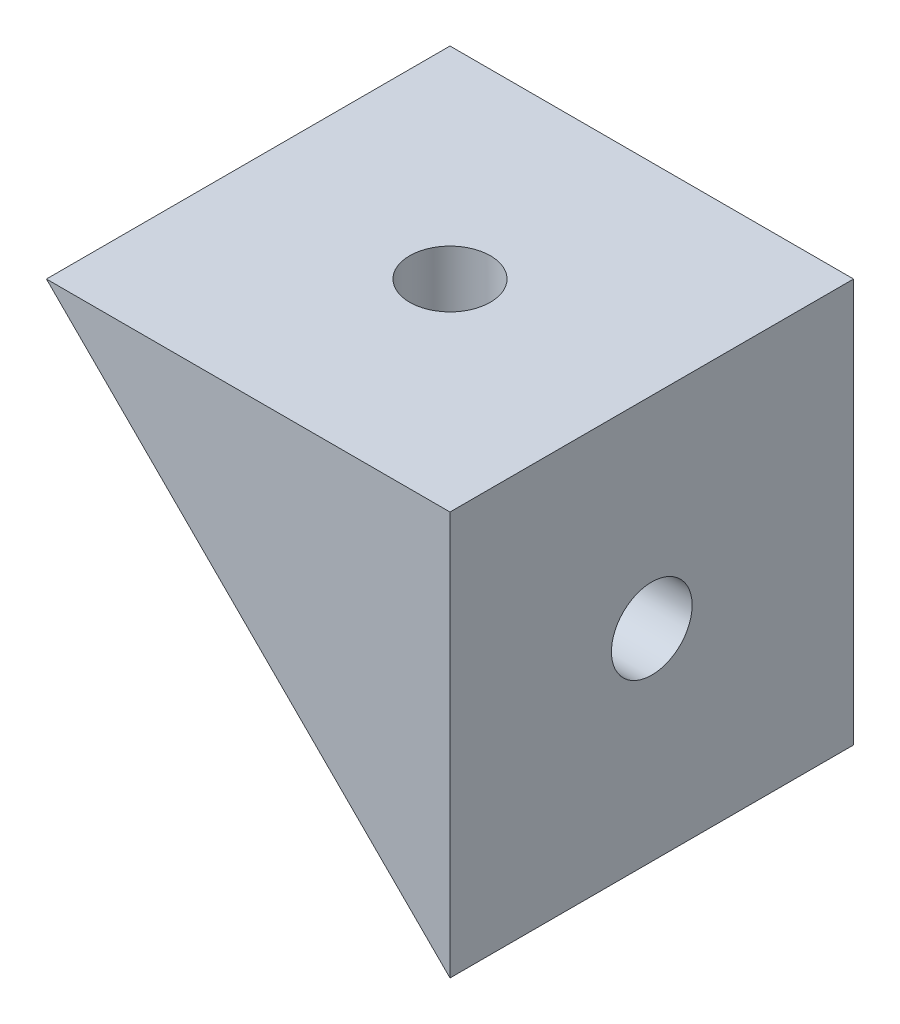
ISO-10303-21;
HEADER;
FILE_DESCRIPTION(('STEP AP214'),'2;1');
FILE_NAME('part.step','',(''),(''),'','','');
FILE_SCHEMA(('AUTOMOTIVE_DESIGN { 1 0 10303 214 1 1 1 1 }'));
ENDSEC;
DATA;
#1=APPLICATION_CONTEXT('core data for automotive mechanical design processes');
#2=APPLICATION_PROTOCOL_DEFINITION('international standard','automotive_design',2000,#1);
#3=PRODUCT_CONTEXT('',#1,'mechanical');
#4=PRODUCT('Part','Part','',(#3));
#5=PRODUCT_RELATED_PRODUCT_CATEGORY('part','',(#4));
#6=PRODUCT_DEFINITION_FORMATION('','',#4);
#7=PRODUCT_DEFINITION_CONTEXT('part definition',#1,'design');
#8=PRODUCT_DEFINITION('design','',#6,#7);
#9=PRODUCT_DEFINITION_SHAPE('','',#8);
#10=(LENGTH_UNIT() NAMED_UNIT(*) SI_UNIT(.MILLI.,.METRE.));
#11=(NAMED_UNIT(*) PLANE_ANGLE_UNIT() SI_UNIT($,.RADIAN.));
#12=(NAMED_UNIT(*) SI_UNIT($,.STERADIAN.) SOLID_ANGLE_UNIT());
#13=UNCERTAINTY_MEASURE_WITH_UNIT(LENGTH_MEASURE(1.E-05),#10,'distance_accuracy_value','');
#14=(GEOMETRIC_REPRESENTATION_CONTEXT(3) GLOBAL_UNCERTAINTY_ASSIGNED_CONTEXT((#13)) GLOBAL_UNIT_ASSIGNED_CONTEXT((#10,
#11,#12)) REPRESENTATION_CONTEXT('',''));
#15=CARTESIAN_POINT('',(0.,0.,0.));
#16=DIRECTION('',(0.,0.,1.));
#17=DIRECTION('',(1.,0.,0.));
#18=AXIS2_PLACEMENT_3D('',#15,#16,#17);
#19=CARTESIAN_POINT('',(-10.0040089885169,-5.,9.99470857192364));
#20=DIRECTION('',(0.,-1.,0.));
#21=DIRECTION('',(0.,0.,-1.));
#22=AXIS2_PLACEMENT_3D('',#19,#20,#21);
#23=CYLINDRICAL_SURFACE('',#22,5.);
#24=CARTESIAN_POINT('',(-10.0040089885169,-9.99599101148306,9.99470857192364));
#25=DIRECTION('',(0.707106781186547,0.707106781186548,0.));
#26=DIRECTION('',(0.707106781186548,-0.707106781186547,0.));
#27=AXIS2_PLACEMENT_3D('',#24,#25,#26);
#28=ELLIPSE('',#27,7.07106781186548,5.);
#29=CARTESIAN_POINT('',(-15.,-5.,9.79452412402498));
#30=VERTEX_POINT('',#29);
#31=CARTESIAN_POINT('',(-12.3895379506144,-7.6104620493857,5.60047922299402));
#32=VERTEX_POINT('',#31);
#33=EDGE_CURVE('E84',#30,#32,#28,.F.);
#34=ORIENTED_EDGE('',*,*,#33,.T.);
#35=CARTESIAN_POINT('',(-15.,-5.04491840494385,9.79452412402489));
#36=CARTESIAN_POINT('',(-14.9954374857848,-5.04890198789021,9.6799394237019));
#37=CARTESIAN_POINT('',(-14.9868834921987,-5.05687639895753,9.56568620500465));
#38=CARTESIAN_POINT('',(-14.9621194992087,-5.08047743614214,9.3389189253314));
#39=CARTESIAN_POINT('',(-14.9459168594568,-5.09609670678205,9.22640329966301));
#40=CARTESIAN_POINT('',(-14.9063495994619,-5.13449507976304,9.0049545411349));
#41=CARTESIAN_POINT('',(-14.883050075108,-5.15720915166731,8.89599842143965));
#42=CARTESIAN_POINT('',(-14.8297194508884,-5.2093582757934,8.6814076569019));
#43=CARTESIAN_POINT('',(-14.7996870370616,-5.23879463992933,8.57577366498597));
#44=CARTESIAN_POINT('',(-14.7005099849909,-5.33616654947173,8.26561637200357));
#45=CARTESIAN_POINT('',(-14.6220986304168,-5.41334663322866,8.06683076178882));
#46=CARTESIAN_POINT('',(-14.4450188131447,-5.58786657627321,7.68788239204103));
#47=CARTESIAN_POINT('',(-14.3463045337853,-5.68525203652922,7.50776316333596));
#48=CARTESIAN_POINT('',(-14.0851226851913,-5.94300117867926,7.09146348838131));
#49=CARTESIAN_POINT('',(-13.9138596540793,-6.11207901022999,6.86611976533708));
#50=CARTESIAN_POINT('',(-13.6395136775188,-6.38272296900059,6.5592937114439));
#51=CARTESIAN_POINT('',(-13.5449682119212,-6.47596095467707,6.46206812589739));
#52=CARTESIAN_POINT('',(-13.350915995902,-6.6672009225812,6.27770773111042));
#53=CARTESIAN_POINT('',(-13.2514093345033,-6.76520281932518,6.19057274089906));
#54=CARTESIAN_POINT('',(-13.0093058925431,-7.00339753923527,5.9945953173938));
#55=CARTESIAN_POINT('',(-12.8648171695891,-7.14535876160886,5.89024111351574));
#56=CARTESIAN_POINT('',(-12.5695308600586,-7.43475741813598,5.69947709592756));
#57=CARTESIAN_POINT('',(-12.4187300447313,-7.58219765046838,5.6130766040328));
#58=CARTESIAN_POINT('',(-12.1126245765345,-7.88010772907625,5.45785265480825));
#59=CARTESIAN_POINT('',(-11.9573413217963,-8.03056238183167,5.38895741866768));
#60=CARTESIAN_POINT('',(-11.6422668633503,-8.33318704484006,5.26769594850237));
#61=CARTESIAN_POINT('',(-11.4824785619268,-8.48535591444134,5.21531932629788));
#62=CARTESIAN_POINT('',(-11.2351752623606,-8.71573791532663,5.14786180914854));
#63=CARTESIAN_POINT('',(-11.1497030101444,-8.79446236050069,5.12693355290082));
#64=CARTESIAN_POINT('',(-10.9758613900071,-8.95108342089543,5.08925497245133));
#65=CARTESIAN_POINT('',(-10.8874744680326,-9.02896858150942,5.07253896343459));
#66=CARTESIAN_POINT('',(-10.7056693866498,-9.1823775079211,5.04330840351266));
#67=CARTESIAN_POINT('',(-10.6121994319393,-9.25785523049949,5.03085358732608));
#68=CARTESIAN_POINT('',(-10.4657997262986,-9.36174371097282,5.01584391555572));
#69=CARTESIAN_POINT('',(-10.4162896214533,-9.39464462509893,5.01146862706481));
#70=CARTESIAN_POINT('',(-10.3137104200046,-9.45435578570828,5.00404547251909));
#71=CARTESIAN_POINT('',(-10.2606653152824,-9.48120256088926,5.00098953762546));
#72=CARTESIAN_POINT('',(-10.175626099101,-9.51266238984703,4.99756814072403));
#73=CARTESIAN_POINT('',(-10.1454034260612,-9.52180021493801,4.99661289118357));
#74=CARTESIAN_POINT('',(-10.0839174373919,-9.53496785641872,4.99525329873677));
#75=CARTESIAN_POINT('',(-10.0526590079976,-9.53901889685926,4.99484666625308));
#76=CARTESIAN_POINT('',(-9.98973224496863,-9.54116859255448,4.99462955321863));
#77=CARTESIAN_POINT('',(-9.95806257683565,-9.53923132212283,4.99482267078219));
#78=CARTESIAN_POINT('',(-9.8955197272423,-9.52978075646818,4.99578706077054));
#79=CARTESIAN_POINT('',(-9.86464982614221,-9.52224739871484,4.99656041349639));
#80=CARTESIAN_POINT('',(-9.78559700066927,-9.49708086874795,4.99924092159399));
#81=CARTESIAN_POINT('',(-9.73855087624132,-9.47608147245817,5.0015537951693));
#82=CARTESIAN_POINT('',(-9.64751264641841,-9.42832524870392,5.007223450052));
#83=CARTESIAN_POINT('',(-9.6035374324426,-9.40153945989278,5.01058552175559));
#84=CARTESIAN_POINT('',(-9.50933471447035,-9.33938223117275,5.01897303191084));
#85=CARTESIAN_POINT('',(-9.45956359756485,-9.30335570582127,5.02419509434221));
#86=CARTESIAN_POINT('',(-9.36189694431177,-9.22900829209096,5.03586751660177));
#87=CARTESIAN_POINT('',(-9.31400310836637,-9.1906853996782,5.0423189603338));
#88=CARTESIAN_POINT('',(-9.17193592047095,-9.07366271102484,5.06349504264432));
#89=CARTESIAN_POINT('',(-9.07959623378911,-8.99306965523205,5.08002088214182));
#90=CARTESIAN_POINT('',(-8.89713680931423,-8.82989423937152,5.11787537326145));
#91=CARTESIAN_POINT('',(-8.80702635873924,-8.74730571424254,5.13922126085687));
#92=CARTESIAN_POINT('',(-8.62871708513613,-8.58167394880129,5.18668700969252));
#93=CARTESIAN_POINT('',(-8.54051603898833,-8.49863139591071,5.21280094337993));
#94=CARTESIAN_POINT('',(-8.28097129522736,-8.25242700473433,5.29748290106038));
#95=CARTESIAN_POINT('',(-8.11168667731286,-8.0894256067321,5.36301885335099));
#96=CARTESIAN_POINT('',(-7.77847535915188,-7.76662059047125,5.51359068770615));
#97=CARTESIAN_POINT('',(-7.61455404106751,-7.6068202433114,5.59864551059126));
#98=CARTESIAN_POINT('',(-7.29380193937072,-7.29312319603808,5.78882721220008));
#99=CARTESIAN_POINT('',(-7.13695207117304,-7.13921079983702,5.89389549938198));
#100=CARTESIAN_POINT('',(-6.83178487626251,-6.8392467568153,6.12513365428025));
#101=CARTESIAN_POINT('',(-6.68345996955619,-6.69318813447701,6.25128437383904));
#102=CARTESIAN_POINT('',(-6.3706845239207,-6.38491914757426,6.55168459720148));
#103=CARTESIAN_POINT('',(-6.20845522118366,-6.22484477933034,6.73051816821711));
#104=CARTESIAN_POINT('',(-5.90518673504328,-5.92554269203956,7.12059078011047));
#105=CARTESIAN_POINT('',(-5.76411778655296,-5.78628569132448,7.33178344106964));
#106=CARTESIAN_POINT('',(-5.53447809144005,-5.55974749773574,7.74352988193311));
#107=CARTESIAN_POINT('',(-5.44102365783414,-5.46761677667179,7.93861513814794));
#108=CARTESIAN_POINT('',(-5.31875034454166,-5.34726647457329,8.24527869330854));
#109=CARTESIAN_POINT('',(-5.28096811855545,-5.31011501696589,8.34987470731976));
#110=CARTESIAN_POINT('',(-5.21198470644097,-5.24237732870359,8.56325649900171));
#111=CARTESIAN_POINT('',(-5.18078046469355,-5.21178804965454,8.672040303455));
#112=CARTESIAN_POINT('',(-5.12527815423086,-5.15750983821534,8.89415879222805));
#113=CARTESIAN_POINT('',(-5.10104539787951,-5.13388611451223,9.00752584060431));
#114=CARTESIAN_POINT('',(-5.06039249472132,-5.09444322196597,9.23693839592703));
#115=CARTESIAN_POINT('',(-5.0439683614294,-5.07862007059518,9.35298250437438));
#116=CARTESIAN_POINT('',(-5.01929790631909,-5.05514692760674,9.58671397875742));
#117=CARTESIAN_POINT('',(-5.01104834827912,-5.04749370151554,9.70440067568401));
#118=CARTESIAN_POINT('',(-5.00291279626652,-5.04054942700533,9.94030204977764));
#119=CARTESIAN_POINT('',(-5.00302572400585,-5.0412573004671,10.0585166569085));
#120=CARTESIAN_POINT('',(-5.01100969140843,-5.05035112594671,10.278133886753));
#121=CARTESIAN_POINT('',(-5.01781652928256,-5.05767268250469,10.3796225384314));
#122=CARTESIAN_POINT('',(-5.03751525043921,-5.07840420468064,10.581410506114));
#123=CARTESIAN_POINT('',(-5.05040898554883,-5.09181602310199,10.6817094506456));
#124=CARTESIAN_POINT('',(-5.08204730796811,-5.1244956776385,10.8803746763006));
#125=CARTESIAN_POINT('',(-5.10078995296609,-5.14376156967145,10.9787415875057));
#126=CARTESIAN_POINT('',(-5.14381021184204,-5.18783608866552,11.1730059283776));
#127=CARTESIAN_POINT('',(-5.16809001253537,-5.21264690543253,11.2689023656701));
#128=CARTESIAN_POINT('',(-5.24939513408608,-5.2955744489063,11.5545433597614));
#129=CARTESIAN_POINT('',(-5.3144801172618,-5.36176747735152,11.7397580165569));
#130=CARTESIAN_POINT('',(-5.4624270832843,-5.5119991416891,12.0949931759509));
#131=CARTESIAN_POINT('',(-5.54529656968078,-5.5960453099369,12.2650072221587));
#132=CARTESIAN_POINT('',(-5.7714853046944,-5.82531991277181,12.671255798545));
#133=CARTESIAN_POINT('',(-5.92408742521863,-5.97989889388745,12.8970770771326));
#134=CARTESIAN_POINT('',(-6.25282175564162,-6.31301063561742,13.3111612251599));
#135=CARTESIAN_POINT('',(-6.42901768092615,-6.4916082647571,13.4993188246862));
#136=CARTESIAN_POINT('',(-6.74077624177654,-6.80807609541217,13.786991784853));
#137=CARTESIAN_POINT('',(-6.87219700318658,-6.94160676049445,13.8959826627391));
#138=CARTESIAN_POINT('',(-7.14100475567391,-7.21520487637623,14.0973196949319));
#139=CARTESIAN_POINT('',(-7.27839452426965,-7.35527537262508,14.1896579952019));
#140=CARTESIAN_POINT('',(-7.55736140528232,-7.64053989999504,14.3582464751992));
#141=CARTESIAN_POINT('',(-7.69893573241955,-7.7857305350048,14.4345070931568));
#142=CARTESIAN_POINT('',(-7.98483106139163,-8.08047758500889,14.5716085464573));
#143=CARTESIAN_POINT('',(-8.12915086162908,-8.23003210471741,14.6324559679602));
#144=CARTESIAN_POINT('',(-8.36846061514733,-8.48078514033361,14.720715866548));
#145=CARTESIAN_POINT('',(-8.46319104178889,-8.58075593669285,14.7524037647048));
#146=CARTESIAN_POINT('',(-8.65213792894712,-8.78269998040782,14.8094921812956));
#147=CARTESIAN_POINT('',(-8.74635493227999,-8.88467014510934,14.8349016657297));
#148=CARTESIAN_POINT('',(-8.90388016851007,-9.0596930679329,14.8726288816161));
#149=CARTESIAN_POINT('',(-8.96772465741187,-9.13192185487649,14.8865640542201));
#150=CARTESIAN_POINT('',(-9.09327192586405,-9.27870263546227,14.9114772410233));
#151=CARTESIAN_POINT('',(-9.15497610907188,-9.35325304322528,14.9224572265073));
#152=CARTESIAN_POINT('',(-9.25633631908882,-9.48480886029907,14.9386776806763));
#153=CARTESIAN_POINT('',(-9.29725873968264,-9.54074896235005,14.9446618469556));
#154=CARTESIAN_POINT('',(-9.37369167170718,-9.65648998884719,14.9549647067987));
#155=CARTESIAN_POINT('',(-9.40921552397313,-9.71628085846005,14.9592875476342));
#156=CARTESIAN_POINT('',(-9.45233162928123,-9.80979560504119,14.9642022743541));
#157=CARTESIAN_POINT('',(-9.46489010756055,-9.84109935755972,14.965569348524));
#158=CARTESIAN_POINT('',(-9.48522237376253,-9.90519151530778,14.9677321456509));
#159=CARTESIAN_POINT('',(-9.49301484563671,-9.93797357499839,14.9685301017668));
#160=CARTESIAN_POINT('',(-9.50228551785405,-10.0049856594928,14.969475042757));
#161=CARTESIAN_POINT('',(-9.50367049011712,-10.0392297898539,14.9696124173998));
#162=CARTESIAN_POINT('',(-9.49945456981179,-10.1072853755356,14.9691861252563));
#163=CARTESIAN_POINT('',(-9.49384466249533,-10.1410962156691,14.96862155383));
#164=CARTESIAN_POINT('',(-9.47454833319878,-10.2172377126419,14.9666078822716));
#165=CARTESIAN_POINT('',(-9.45892801725407,-10.2590412490144,14.9649423997134));
#166=CARTESIAN_POINT('',(-9.4220397576322,-10.3401288980111,14.9607596592725));
#167=CARTESIAN_POINT('',(-9.40073879456486,-10.3793965572343,14.9582373970103));
#168=CARTESIAN_POINT('',(-9.3310300040037,-10.4962886243644,14.9494318869228));
#169=CARTESIAN_POINT('',(-9.27768690886918,-10.5707884325149,14.9419841166781));
#170=CARTESIAN_POINT('',(-9.16638902338963,-10.7159830929102,14.9243802201));
#171=CARTESIAN_POINT('',(-9.1084201590429,-10.7866651438437,14.9142155887443));
#172=CARTESIAN_POINT('',(-8.99008514777577,-10.9261028713432,14.8911967331346));
#173=CARTESIAN_POINT('',(-8.92970977414345,-10.9948489706094,14.8783311449476));
#174=CARTESIAN_POINT('',(-8.80805470654992,-11.1307766550281,14.8499744887803));
#175=CARTESIAN_POINT('',(-8.74677641458146,-11.1979603182268,14.8344871653132));
#176=CARTESIAN_POINT('',(-8.52309253275354,-11.4405409828279,14.7733161123017));
#177=CARTESIAN_POINT('',(-8.35947548492176,-11.6129092115654,14.7197285209078));
#178=CARTESIAN_POINT('',(-8.03392424211933,-11.952566105016,14.5935577371344));
#179=CARTESIAN_POINT('',(-7.87199217757231,-12.1198487567875,14.5209529655204));
#180=CARTESIAN_POINT('',(-7.55268242156956,-12.4480824283793,14.3562627734983));
#181=CARTESIAN_POINT('',(-7.39529279908285,-12.6090505294762,14.2642349271337));
#182=CARTESIAN_POINT('',(-7.08683909722378,-12.923734229139,14.0597237771102));
#183=CARTESIAN_POINT('',(-6.93577000480404,-13.077455588122,13.9472570777058));
#184=CARTESIAN_POINT('',(-6.69541410860422,-13.3216927906623,13.7454590568984));
#185=CARTESIAN_POINT('',(-6.60355520771129,-13.41494841347,13.6624863968121));
#186=CARTESIAN_POINT('',(-6.42411863652566,-13.5970072105519,13.4875728822006));
#187=CARTESIAN_POINT('',(-6.33654082879941,-13.6858105277584,13.3956323158513));
#188=CARTESIAN_POINT('',(-6.08162352889616,-13.9442125763522,13.1061202319253));
#189=CARTESIAN_POINT('',(-5.92174755127443,-14.1061612532623,12.8945693664649));
#190=CARTESIAN_POINT('',(-5.66136587833008,-14.37000068381,12.4822578116881));
#191=CARTESIAN_POINT('',(-5.55543094855212,-14.4773739570843,12.2884365325095));
#192=CARTESIAN_POINT('',(-5.36711481423342,-14.6684545580486,11.878802426818));
#193=CARTESIAN_POINT('',(-5.28470509190567,-14.7521905380134,11.663016660537));
#194=CARTESIAN_POINT('',(-5.15948881426065,-14.8797981049695,11.2477945542902));
#195=CARTESIAN_POINT('',(-5.11255956148579,-14.9278013850186,11.0508824590804));
#196=CARTESIAN_POINT('',(-5.04275044748398,-14.9997343127018,10.6485480747146));
#197=CARTESIAN_POINT('',(-5.01985692844653,-15.0236776315811,10.4431306875715));
#198=CARTESIAN_POINT('',(-4.99982523470575,-15.0458049005599,10.0291403364071));
#199=CARTESIAN_POINT('',(-5.00274859030962,-15.0439273047916,9.82056101701732));
#200=CARTESIAN_POINT('',(-5.03431618794405,-15.0144609550744,9.40721820693541));
#201=CARTESIAN_POINT('',(-5.06296522911978,-14.9868674037592,9.20245543549864));
#202=CARTESIAN_POINT('',(-5.1426230031936,-14.9093135597022,8.8089800405191));
#203=CARTESIAN_POINT('',(-5.19288045579993,-14.8601036758629,8.61996272080747));
#204=CARTESIAN_POINT('',(-5.31265105917353,-14.7424748457055,8.2545304884064));
#205=CARTESIAN_POINT('',(-5.38217311267247,-14.674047018019,8.07812144989837));
#206=CARTESIAN_POINT('',(-5.56961183879868,-14.4893404664352,7.66976797879666));
#207=CARTESIAN_POINT('',(-5.69564005480205,-14.3649874386196,7.44514656158698));
#208=CARTESIAN_POINT('',(-5.9025763650448,-14.1607540860947,7.13218910486642));
#209=CARTESIAN_POINT('',(-5.97463904301409,-14.089625380143,7.03175496617692));
#210=CARTESIAN_POINT('',(-6.12395742970794,-13.9422593887865,6.83875284128707));
#211=CARTESIAN_POINT('',(-6.2012131664242,-13.8660220758452,6.74618489749327));
#212=CARTESIAN_POINT('',(-6.39010341826075,-13.6796817593189,6.53543337841547));
#213=CARTESIAN_POINT('',(-6.50372264994333,-13.5676427705038,6.42074152897934));
#214=CARTESIAN_POINT('',(-6.73775828677042,-13.3370651121341,6.20566152386575));
#215=CARTESIAN_POINT('',(-6.85817794833237,-13.2185233294775,6.10528030338897));
#216=CARTESIAN_POINT('',(-7.10486261460052,-12.9760419054151,5.91806828256795));
#217=CARTESIAN_POINT('',(-7.23114367015761,-12.8520875045818,5.83127793062154));
#218=CARTESIAN_POINT('',(-7.48816939124858,-12.6003962447763,5.67111380276902));
#219=CARTESIAN_POINT('',(-7.61891177321707,-12.4726613252058,5.59773328164583));
#220=CARTESIAN_POINT('',(-7.88877658467402,-12.2100679169709,5.46156296907943));
#221=CARTESIAN_POINT('',(-8.02803267478345,-12.0751152503285,5.399221636263));
#222=CARTESIAN_POINT('',(-8.31051103826696,-11.8034061762908,5.28777868218188));
#223=CARTESIAN_POINT('',(-8.45373929629127,-11.6666472302394,5.23869838592814));
#224=CARTESIAN_POINT('',(-8.67135002919417,-11.4623379791439,5.17499141414062));
#225=CARTESIAN_POINT('',(-8.74412919252789,-11.3945721578144,5.15545127354577));
#226=CARTESIAN_POINT('',(-8.89108905459556,-11.2595996045272,5.11955279195761));
#227=CARTESIAN_POINT('',(-8.96527065096512,-11.1923932732371,5.10319657009224));
#228=CARTESIAN_POINT('',(-9.11532816509016,-11.0597099335898,5.07372571007184));
#229=CARTESIAN_POINT('',(-9.1911976345324,-10.9942279214254,5.06060048225502));
#230=CARTESIAN_POINT('',(-9.3460894532168,-10.8665514125909,5.03756039663758));
#231=CARTESIAN_POINT('',(-9.42510685416993,-10.8043520878785,5.02764070755877));
#232=CARTESIAN_POINT('',(-9.54852404051781,-10.7179322329223,5.01532950243436));
#233=CARTESIAN_POINT('',(-9.59038645115934,-10.6903223131523,5.01165879257754));
#234=CARTESIAN_POINT('',(-9.67666592026061,-10.6392399376456,5.0052476365858));
#235=CARTESIAN_POINT('',(-9.72107794116666,-10.6157596719698,5.0025054251961));
#236=CARTESIAN_POINT('',(-9.79732205895288,-10.5833802547307,4.998891999352));
#237=CARTESIAN_POINT('',(-9.82815830092489,-10.5722499692367,4.99770176106354));
#238=CARTESIAN_POINT('',(-9.89117752930721,-10.5549187834847,4.99588311867911));
#239=CARTESIAN_POINT('',(-9.92335590206161,-10.5487022599523,4.99525293309812));
#240=CARTESIAN_POINT('',(-9.98871709429871,-10.542503680935,4.99462449253628));
#241=CARTESIAN_POINT('',(-10.0219070505331,-10.542590560298,4.99463322485484));
#242=CARTESIAN_POINT('',(-10.0876412738666,-10.549159812264,4.99529935193567));
#243=CARTESIAN_POINT('',(-10.120184417035,-10.5556524672734,4.99595778959047));
#244=CARTESIAN_POINT('',(-10.1973038582794,-10.5773427714755,4.99823968808003));
#245=CARTESIAN_POINT('',(-10.2411214364089,-10.5950662264786,5.00015421597192));
#246=CARTESIAN_POINT('',(-10.3260305596116,-10.6362250632233,5.00490670232809));
#247=CARTESIAN_POINT('',(-10.3671039884139,-10.6596943870566,5.00775018298267));
#248=CARTESIAN_POINT('',(-10.4951875147,-10.7394852855312,5.01810393925029));
#249=CARTESIAN_POINT('',(-10.5783989307895,-10.8015331104047,5.02712887809329));
#250=CARTESIAN_POINT('',(-10.7407419242647,-10.9302759587025,5.04861304877693));
#251=CARTESIAN_POINT('',(-10.8198598601205,-10.9969849721884,5.06108298295101));
#252=CARTESIAN_POINT('',(-10.9759843383691,-11.132688843718,5.08944817362658));
#253=CARTESIAN_POINT('',(-11.0529832039148,-11.2016904114162,5.10535440412959));
#254=CARTESIAN_POINT('',(-11.2053074161712,-11.3404250303106,5.14053806546108));
#255=CARTESIAN_POINT('',(-11.2806349114406,-11.4101569496406,5.15981084705718));
#256=CARTESIAN_POINT('',(-11.5047332629331,-11.6195935079251,5.22271474402011));
#257=CARTESIAN_POINT('',(-11.651764191231,-11.7596687273639,5.27145788970824));
#258=CARTESIAN_POINT('',(-11.9420217539376,-12.0384147647056,5.38295694968726));
#259=CARTESIAN_POINT('',(-12.0852452055632,-12.1770843511874,5.44572419901534));
#260=CARTESIAN_POINT('',(-12.3671346868628,-12.4512033857184,5.58558782966116));
#261=CARTESIAN_POINT('',(-12.5058092510453,-12.5866587143878,5.66265532887417));
#262=CARTESIAN_POINT('',(-12.7780487365088,-12.8532277858795,5.8317331381828));
#263=CARTESIAN_POINT('',(-12.9116158898688,-12.9843434218198,5.92373682636594));
#264=CARTESIAN_POINT('',(-13.1429230190046,-13.2117372569459,6.10069580796164));
#265=CARTESIAN_POINT('',(-13.2419189194587,-13.3091730054807,6.18251826243351));
#266=CARTESIAN_POINT('',(-13.4354601588936,-13.4998067692003,6.35574980886967));
#267=CARTESIAN_POINT('',(-13.5300053617867,-13.5930046548023,6.44715919369501));
#268=CARTESIAN_POINT('',(-13.8056724425193,-13.8648624375789,6.73615351807432));
#269=CARTESIAN_POINT('',(-13.9790981832416,-14.0360546526082,6.94870813037412));
#270=CARTESIAN_POINT('',(-14.2606754835689,-14.3139640894514,7.36248759766844));
#271=CARTESIAN_POINT('',(-14.3747595845728,-14.426546693541,7.5556736175299));
#272=CARTESIAN_POINT('',(-14.528074366196,-14.5777089532915,7.86259870985089));
#273=CARTESIAN_POINT('',(-14.5761701214799,-14.6251044953696,7.96764715873252));
#274=CARTESIAN_POINT('',(-14.6657554873282,-14.7133144141203,8.18315697226123));
#275=CARTESIAN_POINT('',(-14.7072483414689,-14.7541320222304,8.29361564412387));
#276=CARTESIAN_POINT('',(-14.7813002358711,-14.8268799789336,8.51467519012302));
#277=CARTESIAN_POINT('',(-14.814161222971,-14.8591115100669,8.62507538086701));
#278=CARTESIAN_POINT('',(-14.8725094213093,-14.9162133252479,8.84964843231858));
#279=CARTESIAN_POINT('',(-14.8979985940185,-14.9410855674746,8.9638202804492));
#280=CARTESIAN_POINT('',(-14.9412836446846,-14.9831385756151,9.19632270464213));
#281=CARTESIAN_POINT('',(-14.9589945290015,-15.0002344375366,9.31468465688505));
#282=CARTESIAN_POINT('',(-14.9859568409286,-15.0259709743952,9.5534140666223));
#283=CARTESIAN_POINT('',(-14.9951982316967,-15.0346016184054,9.67378373190015));
#284=CARTESIAN_POINT('',(-15.,-15.0387933661778,9.79452412402489));
#285=B_SPLINE_CURVE_WITH_KNOTS('',3,(#35,#36,#37,#38,#39,#40,#41,#42,#43,#44,#45,#46,#47,#48,
#49,#50,#51,#52,#53,#54,#55,#56,#57,#58,#59,#60,#61,#62,#63,#64,#65,#66,#67,#68,#69,#70,#71,#72,
#73,#74,#75,#76,#77,#78,#79,#80,#81,#82,#83,#84,#85,#86,#87,#88,#89,#90,#91,#92,#93,#94,#95,#96,
#97,#98,#99,#100,#101,#102,#103,#104,#105,#106,#107,#108,#109,#110,#111,#112,#113,#114,#115,
#116,#117,#118,#119,#120,#121,#122,#123,#124,#125,#126,#127,#128,#129,#130,#131,#132,#133,#134,
#135,#136,#137,#138,#139,#140,#141,#142,#143,#144,#145,#146,#147,#148,#149,#150,#151,#152,#153,
#154,#155,#156,#157,#158,#159,#160,#161,#162,#163,#164,#165,#166,#167,#168,#169,#170,#171,#172,
#173,#174,#175,#176,#177,#178,#179,#180,#181,#182,#183,#184,#185,#186,#187,#188,#189,#190,#191,
#192,#193,#194,#195,#196,#197,#198,#199,#200,#201,#202,#203,#204,#205,#206,#207,#208,#209,#210,
#211,#212,#213,#214,#215,#216,#217,#218,#219,#220,#221,#222,#223,#224,#225,#226,#227,#228,#229,
#230,#231,#232,#233,#234,#235,#236,#237,#238,#239,#240,#241,#242,#243,#244,#245,#246,#247,#248,
#249,#250,#251,#252,#253,#254,#255,#256,#257,#258,#259,#260,#261,#262,#263,#264,#265,#266,#267,
#268,#269,#270,#271,#272,#273,#274,#275,#276,#277,#278,#279,#280,#281,#282,#283,#284),
.UNSPECIFIED.,.F.,.F.,(4,2,2,2,2,2,2,2,2,2,2,2,2,2,2,2,2,2,2,2,2,2,2,2,2,2,2,2,2,2,2,2,2,2,2,2,
2,2,2,2,2,2,2,2,2,2,2,2,2,2,2,2,2,2,2,2,2,2,2,2,2,2,2,2,2,2,2,2,2,2,2,2,2,2,2,2,2,2,2,2,2,2,2,2,
2,2,2,2,2,2,2,2,2,2,2,2,2,2,2,2,2,2,2,2,2,2,2,2,2,2,2,2,2,2,2,2,2,2,2,2,2,2,2,2,4),(0.,
0.344046639217058,0.687762903842369,1.02841682511756,1.36913728488503,2.04749895114188,
2.72740857973846,3.71063217938784,4.20404487956561,4.69744872920722,5.38004993428683,
6.06300467462975,6.74311210200275,7.42279096850743,7.77690642929427,8.13381966843093,
8.49554882306847,8.67423421958413,8.85181078337965,8.94624953496525,9.0402929275566,
9.13490160755745,9.22985111605853,9.38368962240329,9.53831671969889,9.72314465121666,
9.90813629959261,10.2789357167146,10.6510826817544,11.0227701117478,11.7538035870845,
12.4855494687027,13.2151851271159,13.9441616587139,14.8103779170539,15.6753640548421,
16.377679478959,16.7290610838191,17.0802791027137,17.4346876680332,17.7889151046683,
18.1430022505872,18.4970437393552,18.8026169565333,19.1082831987405,19.4138480428283,
19.7195337747278,20.3384671113316,20.957662100429,21.8924445151977,22.8298042431463,
23.479255764767,24.1290127977542,24.7783466762703,25.4274026203072,25.8512415061126,
26.274471576902,26.5666357438053,26.858604534126,27.0672421216745,27.2753554374495,
27.3763690074055,27.4769839969932,27.5790584081464,27.6812645051872,27.8144773101988,
27.9484819754014,28.223514701027,28.4994186990846,28.7765076665174,29.0532041679689,
29.7831925860131,30.5140129546045,31.2426967028588,31.970791103015,32.4353705227305,
32.8999350185044,33.8273409530366,34.5614717721941,35.2947088452364,35.9161396497832,
36.5372171476475,37.1597752811079,37.7824495773694,38.3850327647896,38.9878948891585,
39.8408662188228,40.268424857173,40.6959858003397,41.2846619930902,41.8736225066508,
42.4643038381375,43.0546872309681,43.6652778787276,44.2768446482009,44.5808363995422,
44.8850297927109,45.1882124978612,45.4909361018176,45.6416740669822,45.7921238195579,
45.8902565194508,45.9880759377193,46.0869652816359,46.1860136191737,46.3271239219845,
46.4690888060803,46.7808079901426,47.0935066771462,47.4072191494279,47.7205017590462,
48.3464807975002,48.9729676281066,49.5982026550128,50.2231612391578,50.7063989107097,
51.1896513484833,52.1548690042608,52.904898142824,53.2791386304964,53.6531947068157,
54.011545916198,54.3698016886232,54.7318802358786,55.0943873145),.UNSPECIFIED.);
#286=CARTESIAN_POINT('',(-7.57261515234485,-12.4273848476551,14.3637272275744));
#287=VERTEX_POINT('',#286);
#288=EDGE_CURVE('E11',#32,#287,#285,.T.);
#289=ORIENTED_EDGE('',*,*,#288,.T.);
#290=CARTESIAN_POINT('',(-15.,-5.,10.1948930198223));
#291=VERTEX_POINT('',#290);
#292=EDGE_CURVE('E54',#287,#291,#28,.F.);
#293=ORIENTED_EDGE('',*,*,#292,.T.);
#294=CARTESIAN_POINT('',(-10.0040089885169,-5.,9.99470857192364));
#295=DIRECTION('',(0.,1.,0.));
#296=DIRECTION('',(0.,0.,1.));
#297=AXIS2_PLACEMENT_3D('',#294,#295,#296);
#298=CIRCLE('',#297,5.);
#299=EDGE_CURVE('E87',#291,#30,#298,.T.);
#300=ORIENTED_EDGE('',*,*,#299,.T.);
#301=EDGE_LOOP('',(#34,#289,#293,#300));
#302=FACE_BOUND('',#301,.T.);
#303=ADVANCED_FACE('F33',(#302),#23,.F.);
#304=CARTESIAN_POINT('',(-20.,0.,20.));
#305=DIRECTION('',(0.707106781186547,0.707106781186548,0.));
#306=DIRECTION('',(-0.707106781186548,0.707106781186547,0.));
#307=AXIS2_PLACEMENT_3D('',#304,#305,#306);
#308=PLANE('',#307);
#309=CARTESIAN_POINT('',(-9.95814411443916,-10.0418558855608,9.96949787864309));
#310=DIRECTION('',(0.707106781186547,0.707106781186548,0.));
#311=DIRECTION('',(-0.707106781186548,0.707106781186547,0.));
#312=AXIS2_PLACEMENT_3D('',#309,#310,#311);
#313=ELLIPSE('',#312,7.07106781186548,5.);
#314=EDGE_CURVE('E48',#32,#287,#313,.F.);
#315=ORIENTED_EDGE('',*,*,#314,.F.);
#316=ORIENTED_EDGE('',*,*,#33,.F.);
#317=CARTESIAN_POINT('',(-15.,-5.,9.79452412402498));
#318=DIRECTION('',(0.,0.,1.));
#319=VECTOR('',#318,1.);
#320=LINE('',#317,#319);
#321=EDGE_CURVE('E92',#30,#291,#320,.T.);
#322=ORIENTED_EDGE('',*,*,#321,.T.);
#323=ORIENTED_EDGE('',*,*,#292,.F.);
#324=EDGE_LOOP('',(#315,#316,#322,#323));
#325=FACE_BOUND('',#324,.T.);
#326=DIRECTION('',(0.707106781186548,-0.707106781186547,0.));
#327=VECTOR('',#326,1.);
#328=CARTESIAN_POINT('',(-20.,0.,0.));
#329=LINE('',#328,#327);
#330=CARTESIAN_POINT('',(-20.,0.,0.));
#331=VERTEX_POINT('',#330);
#332=CARTESIAN_POINT('',(0.,-20.,0.));
#333=VERTEX_POINT('',#332);
#334=EDGE_CURVE('E176',#331,#333,#329,.T.);
#335=ORIENTED_EDGE('',*,*,#334,.T.);
#336=DIRECTION('',(0.,0.,-1.));
#337=VECTOR('',#336,1.);
#338=CARTESIAN_POINT('',(0.,-20.,20.));
#339=LINE('',#338,#337);
#340=CARTESIAN_POINT('',(0.,-20.,20.));
#341=VERTEX_POINT('',#340);
#342=EDGE_CURVE('E182',#341,#333,#339,.T.);
#343=ORIENTED_EDGE('',*,*,#342,.F.);
#344=DIRECTION('',(0.707106781186548,-0.707106781186547,0.));
#345=VECTOR('',#344,1.);
#346=CARTESIAN_POINT('',(-20.,0.,20.));
#347=LINE('',#346,#345);
#348=CARTESIAN_POINT('',(-20.,0.,20.));
#349=VERTEX_POINT('',#348);
#350=EDGE_CURVE('E181',#349,#341,#347,.T.);
#351=ORIENTED_EDGE('',*,*,#350,.F.);
#352=DIRECTION('',(0.,0.,-1.));
#353=VECTOR('',#352,1.);
#354=CARTESIAN_POINT('',(-20.,0.,20.));
#355=LINE('',#354,#353);
#356=EDGE_CURVE('E169',#349,#331,#355,.T.);
#357=ORIENTED_EDGE('',*,*,#356,.T.);
#358=EDGE_LOOP('',(#335,#343,#351,#357));
#359=FACE_BOUND('',#358,.T.);
#360=ADVANCED_FACE('F81',(#325,#359),#308,.F.);
#361=CARTESIAN_POINT('',(-20.,-10.,10.));
#362=DIRECTION('',(1.,0.,0.));
#363=DIRECTION('',(0.,0.,-1.));
#364=AXIS2_PLACEMENT_3D('',#361,#362,#363);
#365=CYLINDRICAL_SURFACE('',#364,2.);
#366=CARTESIAN_POINT('',(-4.,-10.,10.));
#367=DIRECTION('',(1.,0.,0.));
#368=DIRECTION('',(0.,0.,-1.));
#369=AXIS2_PLACEMENT_3D('',#366,#367,#368);
#370=CIRCLE('',#369,2.);
#371=CARTESIAN_POINT('',(-4.,-10.,8.));
#372=VERTEX_POINT('',#371);
#373=EDGE_CURVE('E37',#372,#372,#370,.F.);
#374=ORIENTED_EDGE('',*,*,#373,.T.);
#375=EDGE_LOOP('',(#374));
#376=FACE_BOUND('',#375,.T.);
#377=CARTESIAN_POINT('',(0.,-10.,10.));
#378=DIRECTION('',(1.,0.,0.));
#379=DIRECTION('',(0.,0.,-1.));
#380=AXIS2_PLACEMENT_3D('',#377,#378,#379);
#381=CIRCLE('',#380,2.);
#382=CARTESIAN_POINT('',(0.,-10.,8.));
#383=VERTEX_POINT('',#382);
#384=EDGE_CURVE('E195',#383,#383,#381,.T.);
#385=ORIENTED_EDGE('',*,*,#384,.T.);
#386=EDGE_LOOP('',(#385));
#387=FACE_BOUND('',#386,.T.);
#388=ADVANCED_FACE('F143',(#376,#387),#365,.F.);
#389=CARTESIAN_POINT('',(0.,-20.,20.));
#390=DIRECTION('',(-1.,0.,0.));
#391=DIRECTION('',(0.,0.,1.));
#392=AXIS2_PLACEMENT_3D('',#389,#390,#391);
#393=PLANE('',#392);
#394=ORIENTED_EDGE('',*,*,#384,.F.);
#395=EDGE_LOOP('',(#394));
#396=FACE_BOUND('',#395,.T.);
#397=DIRECTION('',(0.,1.,0.));
#398=VECTOR('',#397,1.);
#399=CARTESIAN_POINT('',(0.,-20.,0.));
#400=LINE('',#399,#398);
#401=CARTESIAN_POINT('',(0.,0.,0.));
#402=VERTEX_POINT('',#401);
#403=EDGE_CURVE('E177',#333,#402,#400,.T.);
#404=ORIENTED_EDGE('',*,*,#403,.T.);
#405=DIRECTION('',(0.,0.,-1.));
#406=VECTOR('',#405,1.);
#407=CARTESIAN_POINT('',(0.,0.,20.));
#408=LINE('',#407,#406);
#409=CARTESIAN_POINT('',(0.,0.,20.));
#410=VERTEX_POINT('',#409);
#411=EDGE_CURVE('E42',#410,#402,#408,.T.);
#412=ORIENTED_EDGE('',*,*,#411,.F.);
#413=DIRECTION('',(0.,1.,0.));
#414=VECTOR('',#413,1.);
#415=CARTESIAN_POINT('',(0.,-20.,20.));
#416=LINE('',#415,#414);
#417=EDGE_CURVE('E184',#341,#410,#416,.T.);
#418=ORIENTED_EDGE('',*,*,#417,.F.);
#419=ORIENTED_EDGE('',*,*,#342,.T.);
#420=EDGE_LOOP('',(#404,#412,#418,#419));
#421=FACE_BOUND('',#420,.T.);
#422=ADVANCED_FACE('F35',(#396,#421),#393,.F.);
#423=CARTESIAN_POINT('',(0.,0.,20.));
#424=DIRECTION('',(0.,-1.,0.));
#425=DIRECTION('',(1.,0.,0.));
#426=AXIS2_PLACEMENT_3D('',#423,#424,#425);
#427=PLANE('',#426);
#428=CARTESIAN_POINT('',(-10.,0.,10.));
#429=DIRECTION('',(0.,1.,0.));
#430=DIRECTION('',(-1.,0.,0.));
#431=AXIS2_PLACEMENT_3D('',#428,#429,#430);
#432=CIRCLE('',#431,2.);
#433=CARTESIAN_POINT('',(-12.,0.,10.));
#434=VERTEX_POINT('',#433);
#435=EDGE_CURVE('E164',#434,#434,#432,.T.);
#436=ORIENTED_EDGE('',*,*,#435,.F.);
#437=EDGE_LOOP('',(#436));
#438=FACE_BOUND('',#437,.T.);
#439=DIRECTION('',(-1.,0.,0.));
#440=VECTOR('',#439,1.);
#441=CARTESIAN_POINT('',(0.,0.,0.));
#442=LINE('',#441,#440);
#443=EDGE_CURVE('E167',#402,#331,#442,.T.);
#444=ORIENTED_EDGE('',*,*,#443,.T.);
#445=ORIENTED_EDGE('',*,*,#356,.F.);
#446=DIRECTION('',(-1.,0.,0.));
#447=VECTOR('',#446,1.);
#448=CARTESIAN_POINT('',(0.,0.,20.));
#449=LINE('',#448,#447);
#450=EDGE_CURVE('E187',#410,#349,#449,.T.);
#451=ORIENTED_EDGE('',*,*,#450,.F.);
#452=ORIENTED_EDGE('',*,*,#411,.T.);
#453=EDGE_LOOP('',(#444,#445,#451,#452));
#454=FACE_BOUND('',#453,.T.);
#455=ADVANCED_FACE('F151',(#438,#454),#427,.F.);
#456=CARTESIAN_POINT('',(0.,0.,20.));
#457=DIRECTION('',(0.,0.,1.));
#458=DIRECTION('',(1.,0.,0.));
#459=AXIS2_PLACEMENT_3D('',#456,#457,#458);
#460=PLANE('',#459);
#461=ORIENTED_EDGE('',*,*,#417,.T.);
#462=ORIENTED_EDGE('',*,*,#450,.T.);
#463=ORIENTED_EDGE('',*,*,#350,.T.);
#464=EDGE_LOOP('',(#461,#462,#463));
#465=FACE_BOUND('',#464,.T.);
#466=ADVANCED_FACE('F153',(#465),#460,.T.);
#467=CARTESIAN_POINT('',(0.,0.,0.));
#468=DIRECTION('',(0.,0.,1.));
#469=DIRECTION('',(1.,0.,0.));
#470=AXIS2_PLACEMENT_3D('',#467,#468,#469);
#471=PLANE('',#470);
#472=ORIENTED_EDGE('',*,*,#403,.F.);
#473=ORIENTED_EDGE('',*,*,#334,.F.);
#474=ORIENTED_EDGE('',*,*,#443,.F.);
#475=EDGE_LOOP('',(#472,#473,#474));
#476=FACE_BOUND('',#475,.T.);
#477=ADVANCED_FACE('F134',(#476),#471,.F.);
#478=CARTESIAN_POINT('',(-10.,-20.,10.));
#479=DIRECTION('',(0.,1.,0.));
#480=DIRECTION('',(-1.,0.,0.));
#481=AXIS2_PLACEMENT_3D('',#478,#479,#480);
#482=CYLINDRICAL_SURFACE('',#481,2.);
#483=CARTESIAN_POINT('',(-10.,-5.,10.));
#484=DIRECTION('',(0.,1.,0.));
#485=DIRECTION('',(0.,0.,1.));
#486=AXIS2_PLACEMENT_3D('',#483,#484,#485);
#487=CIRCLE('',#486,2.);
#488=CARTESIAN_POINT('',(-10.,-5.,12.));
#489=VERTEX_POINT('',#488);
#490=EDGE_CURVE('E89',#489,#489,#487,.F.);
#491=ORIENTED_EDGE('',*,*,#490,.T.);
#492=EDGE_LOOP('',(#491));
#493=FACE_BOUND('',#492,.T.);
#494=ORIENTED_EDGE('',*,*,#435,.T.);
#495=EDGE_LOOP('',(#494));
#496=FACE_BOUND('',#495,.T.);
#497=ADVANCED_FACE('F127',(#493,#496),#482,.F.);
#498=CARTESIAN_POINT('',(-10.0040089885169,-5.,9.99470857192364));
#499=DIRECTION('',(0.,1.,0.));
#500=DIRECTION('',(0.,0.,1.));
#501=AXIS2_PLACEMENT_3D('',#498,#499,#500);
#502=PLANE('',#501);
#503=ORIENTED_EDGE('',*,*,#490,.F.);
#504=EDGE_LOOP('',(#503));
#505=FACE_BOUND('',#504,.T.);
#506=ORIENTED_EDGE('',*,*,#299,.F.);
#507=ORIENTED_EDGE('',*,*,#321,.F.);
#508=EDGE_LOOP('',(#506,#507));
#509=FACE_BOUND('',#508,.T.);
#510=ADVANCED_FACE('F124',(#505,#509),#502,.F.);
#511=CARTESIAN_POINT('',(-4.,-10.0418558855608,9.96949787864309));
#512=DIRECTION('',(1.,0.,0.));
#513=DIRECTION('',(0.,0.,-1.));
#514=AXIS2_PLACEMENT_3D('',#511,#512,#513);
#515=PLANE('',#514);
#516=CARTESIAN_POINT('',(-4.,-10.0418558855608,9.96949787864309));
#517=DIRECTION('',(1.,0.,0.));
#518=DIRECTION('',(0.,0.,-1.));
#519=AXIS2_PLACEMENT_3D('',#516,#517,#518);
#520=CIRCLE('',#519,5.);
#521=CARTESIAN_POINT('',(-4.,-10.0418558855608,4.96949787864309));
#522=VERTEX_POINT('',#521);
#523=EDGE_CURVE('E85',#522,#522,#520,.T.);
#524=ORIENTED_EDGE('',*,*,#523,.F.);
#525=EDGE_LOOP('',(#524));
#526=FACE_BOUND('',#525,.T.);
#527=ORIENTED_EDGE('',*,*,#373,.F.);
#528=EDGE_LOOP('',(#527));
#529=FACE_BOUND('',#528,.T.);
#530=ADVANCED_FACE('F122',(#526,#529),#515,.F.);
#531=CARTESIAN_POINT('',(-4.,-10.0418558855608,9.96949787864309));
#532=DIRECTION('',(-1.,0.,0.));
#533=DIRECTION('',(0.,0.,1.));
#534=AXIS2_PLACEMENT_3D('',#531,#532,#533);
#535=CYLINDRICAL_SURFACE('',#534,5.);
#536=ORIENTED_EDGE('',*,*,#523,.T.);
#537=EDGE_LOOP('',(#536));
#538=FACE_BOUND('',#537,.T.);
#539=ORIENTED_EDGE('',*,*,#314,.T.);
#540=ORIENTED_EDGE('',*,*,#288,.F.);
#541=EDGE_LOOP('',(#539,#540));
#542=FACE_BOUND('',#541,.T.);
#543=ADVANCED_FACE('F77',(#538,#542),#535,.F.);
#544=CLOSED_SHELL('',(#303,#360,#388,#422,#455,#466,#477,#497,#510,#530,#543));
#545=MANIFOLD_SOLID_BREP('B2',#544);
#546=ADVANCED_BREP_SHAPE_REPRESENTATION('',(#18,#545),#14);
#547=SHAPE_DEFINITION_REPRESENTATION(#9,#546);
ENDSEC;
END-ISO-10303-21;
